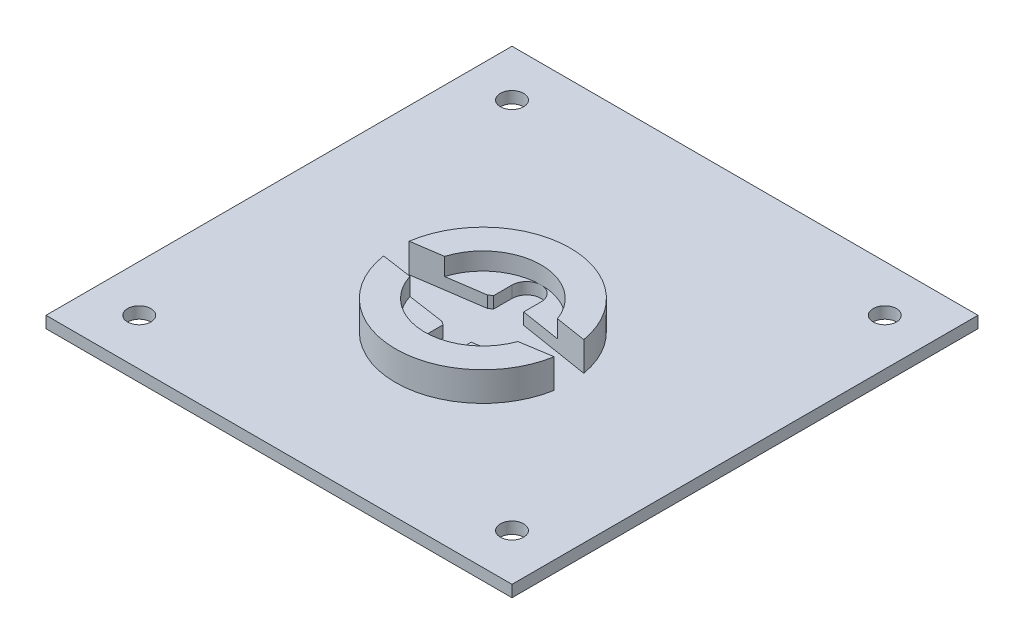
ISO-10303-21;
HEADER;
FILE_DESCRIPTION(('STEP AP214'),'2;1');
FILE_NAME('part.step','',(''),(''),'','','');
FILE_SCHEMA(('AUTOMOTIVE_DESIGN { 1 0 10303 214 1 1 1 1 }'));
ENDSEC;
DATA;
#1=APPLICATION_CONTEXT('core data for automotive mechanical design processes');
#2=APPLICATION_PROTOCOL_DEFINITION('international standard','automotive_design',2000,#1);
#3=PRODUCT_CONTEXT('',#1,'mechanical');
#4=PRODUCT('Part','Part','',(#3));
#5=PRODUCT_RELATED_PRODUCT_CATEGORY('part','',(#4));
#6=PRODUCT_DEFINITION_FORMATION('','',#4);
#7=PRODUCT_DEFINITION_CONTEXT('part definition',#1,'design');
#8=PRODUCT_DEFINITION('design','',#6,#7);
#9=PRODUCT_DEFINITION_SHAPE('','',#8);
#10=(LENGTH_UNIT() NAMED_UNIT(*) SI_UNIT(.MILLI.,.METRE.));
#11=(NAMED_UNIT(*) PLANE_ANGLE_UNIT() SI_UNIT($,.RADIAN.));
#12=(NAMED_UNIT(*) SI_UNIT($,.STERADIAN.) SOLID_ANGLE_UNIT());
#13=UNCERTAINTY_MEASURE_WITH_UNIT(LENGTH_MEASURE(1.E-05),#10,'distance_accuracy_value','');
#14=(GEOMETRIC_REPRESENTATION_CONTEXT(3) GLOBAL_UNCERTAINTY_ASSIGNED_CONTEXT((#13)) GLOBAL_UNIT_ASSIGNED_CONTEXT((#10,
#11,#12)) REPRESENTATION_CONTEXT('',''));
#15=CARTESIAN_POINT('',(0.,0.,0.));
#16=DIRECTION('',(0.,0.,1.));
#17=DIRECTION('',(1.,0.,0.));
#18=AXIS2_PLACEMENT_3D('',#15,#16,#17);
#19=CARTESIAN_POINT('',(0.,7.,5.));
#20=DIRECTION('',(0.,1.,0.));
#21=DIRECTION('',(0.,0.,1.));
#22=AXIS2_PLACEMENT_3D('',#19,#20,#21);
#23=PLANE('',#22);
#24=CARTESIAN_POINT('',(0.,7.,5.));
#25=DIRECTION('',(0.,1.,0.));
#26=DIRECTION('',(0.,0.,1.));
#27=AXIS2_PLACEMENT_3D('',#24,#25,#26);
#28=CIRCLE('',#27,10.);
#29=CARTESIAN_POINT('',(-9.5497865032323,7.,7.96674531139466));
#30=VERTEX_POINT('',#29);
#31=CARTESIAN_POINT('',(9.40513900756368,7.,8.39755209649594));
#32=VERTEX_POINT('',#31);
#33=EDGE_CURVE('E309',#30,#32,#28,.T.);
#34=ORIENTED_EDGE('',*,*,#33,.F.);
#35=DIRECTION('',(-0.989429297222425,0.,-0.145016088065904));
#36=VECTOR('',#35,1.);
#37=CARTESIAN_POINT('',(-0.626506828898814,7.,9.27458925206073));
#38=LINE('',#37,#36);
#39=CARTESIAN_POINT('',(-14.8390439676939,7.,7.19152324305401));
#40=VERTEX_POINT('',#39);
#41=EDGE_CURVE('E259',#30,#40,#38,.T.);
#42=ORIENTED_EDGE('',*,*,#41,.T.);
#43=CARTESIAN_POINT('',(0.,7.,5.));
#44=DIRECTION('',(0.,1.,0.));
#45=DIRECTION('',(0.,0.,1.));
#46=AXIS2_PLACEMENT_3D('',#43,#44,#45);
#47=CIRCLE('',#46,15.);
#48=CARTESIAN_POINT('',(14.7835799441672,7.,7.53885092796277));
#49=VERTEX_POINT('',#48);
#50=EDGE_CURVE('E320',#40,#49,#47,.T.);
#51=ORIENTED_EDGE('',*,*,#50,.T.);
#52=DIRECTION('',(-0.987493548405866,0.,0.157659417279122));
#53=VECTOR('',#52,1.);
#54=CARTESIAN_POINT('',(0.762735687980508,7.,9.77736493016584));
#55=LINE('',#54,#53);
#56=EDGE_CURVE('E276',#49,#32,#55,.T.);
#57=ORIENTED_EDGE('',*,*,#56,.T.);
#58=EDGE_LOOP('',(#34,#42,#51,#57));
#59=FACE_BOUND('',#58,.T.);
#60=ADVANCED_FACE('F35',(#59),#23,.T.);
#61=CARTESIAN_POINT('',(9.40513900756368,7.,1.60244790350406));
#62=VERTEX_POINT('',#61);
#63=CARTESIAN_POINT('',(-9.5497865032323,7.,2.03325468860534));
#64=VERTEX_POINT('',#63);
#65=EDGE_CURVE('E306',#62,#64,#28,.T.);
#66=ORIENTED_EDGE('',*,*,#65,.F.);
#67=DIRECTION('',(0.987493548405866,0.,0.157659417279122));
#68=VECTOR('',#67,1.);
#69=CARTESIAN_POINT('',(0.762735687980509,7.,0.222635069834163));
#70=LINE('',#69,#68);
#71=CARTESIAN_POINT('',(14.7835799441672,7.,2.46114907203723));
#72=VERTEX_POINT('',#71);
#73=EDGE_CURVE('E269',#62,#72,#70,.T.);
#74=ORIENTED_EDGE('',*,*,#73,.T.);
#75=CARTESIAN_POINT('',(-14.8390439676939,7.,2.80847675694599));
#76=VERTEX_POINT('',#75);
#77=EDGE_CURVE('E323',#72,#76,#47,.T.);
#78=ORIENTED_EDGE('',*,*,#77,.T.);
#79=DIRECTION('',(0.989429297222425,0.,-0.145016088065904));
#80=VECTOR('',#79,1.);
#81=CARTESIAN_POINT('',(-0.626506828898814,7.,0.725410747939271));
#82=LINE('',#81,#80);
#83=EDGE_CURVE('E247',#76,#64,#82,.T.);
#84=ORIENTED_EDGE('',*,*,#83,.T.);
#85=EDGE_LOOP('',(#66,#74,#78,#84));
#86=FACE_BOUND('',#85,.T.);
#87=ADVANCED_FACE('F423',(#86),#23,.T.);
#88=CARTESIAN_POINT('',(0.,7.,5.));
#89=DIRECTION('',(0.,-1.,0.));
#90=DIRECTION('',(0.,0.,-1.));
#91=AXIS2_PLACEMENT_3D('',#88,#89,#90);
#92=CYLINDRICAL_SURFACE('',#91,15.);
#93=DIRECTION('',(0.,-1.,0.));
#94=VECTOR('',#93,1.);
#95=CARTESIAN_POINT('',(-14.8390439676939,7.,7.19152324305401));
#96=LINE('',#95,#94);
#97=CARTESIAN_POINT('',(-14.8390439676939,2.,7.19152324305401));
#98=VERTEX_POINT('',#97);
#99=EDGE_CURVE('E262',#98,#40,#96,.F.);
#100=ORIENTED_EDGE('',*,*,#99,.F.);
#101=CARTESIAN_POINT('',(0.,2.,5.));
#102=DIRECTION('',(0.,1.,0.));
#103=DIRECTION('',(0.,0.,1.));
#104=AXIS2_PLACEMENT_3D('',#101,#102,#103);
#105=CIRCLE('',#104,15.);
#106=CARTESIAN_POINT('',(14.7835799441672,2.,7.53885092796277));
#107=VERTEX_POINT('',#106);
#108=EDGE_CURVE('E324',#98,#107,#105,.T.);
#109=ORIENTED_EDGE('',*,*,#108,.T.);
#110=DIRECTION('',(0.,-1.,0.));
#111=VECTOR('',#110,1.);
#112=CARTESIAN_POINT('',(14.7835799441672,7.,7.53885092796277));
#113=LINE('',#112,#111);
#114=EDGE_CURVE('E279',#49,#107,#113,.T.);
#115=ORIENTED_EDGE('',*,*,#114,.F.);
#116=ORIENTED_EDGE('',*,*,#50,.F.);
#117=EDGE_LOOP('',(#100,#109,#115,#116));
#118=FACE_BOUND('',#117,.T.);
#119=ADVANCED_FACE('F440',(#118),#92,.T.);
#120=DIRECTION('',(0.,-1.,0.));
#121=VECTOR('',#120,1.);
#122=CARTESIAN_POINT('',(14.7835799441672,7.,2.46114907203723));
#123=LINE('',#122,#121);
#124=CARTESIAN_POINT('',(14.7835799441672,2.,2.46114907203723));
#125=VERTEX_POINT('',#124);
#126=EDGE_CURVE('E272',#125,#72,#123,.F.);
#127=ORIENTED_EDGE('',*,*,#126,.F.);
#128=CARTESIAN_POINT('',(-14.8390439676939,2.,2.80847675694599));
#129=VERTEX_POINT('',#128);
#130=EDGE_CURVE('E327',#125,#129,#105,.T.);
#131=ORIENTED_EDGE('',*,*,#130,.T.);
#132=DIRECTION('',(0.,-1.,0.));
#133=VECTOR('',#132,1.);
#134=CARTESIAN_POINT('',(-14.8390439676939,7.,2.80847675694599));
#135=LINE('',#134,#133);
#136=EDGE_CURVE('E250',#76,#129,#135,.T.);
#137=ORIENTED_EDGE('',*,*,#136,.F.);
#138=ORIENTED_EDGE('',*,*,#77,.F.);
#139=EDGE_LOOP('',(#127,#131,#137,#138));
#140=FACE_BOUND('',#139,.T.);
#141=ADVANCED_FACE('F416',(#140),#92,.T.);
#142=CARTESIAN_POINT('',(0.,4.,0.));
#143=DIRECTION('',(0.,-1.,0.));
#144=DIRECTION('',(0.,0.,-1.));
#145=AXIS2_PLACEMENT_3D('',#142,#143,#144);
#146=PLANE('',#145);
#147=DIRECTION('',(0.989429297222425,0.,0.145016088065904));
#148=VECTOR('',#147,1.);
#149=CARTESIAN_POINT('',(-1.34392265940378,4.,9.16944092307104));
#150=LINE('',#149,#148);
#151=CARTESIAN_POINT('',(-9.5497865032323,4.,7.96674531139466));
#152=VERTEX_POINT('',#151);
#153=CARTESIAN_POINT('',(-3.11691745392,4.,8.90958125448863));
#154=VERTEX_POINT('',#153);
#155=EDGE_CURVE('E255',#152,#154,#150,.T.);
#156=ORIENTED_EDGE('',*,*,#155,.F.);
#157=CARTESIAN_POINT('',(0.,4.,5.));
#158=DIRECTION('',(0.,-1.,0.));
#159=DIRECTION('',(0.,0.,-1.));
#160=AXIS2_PLACEMENT_3D('',#157,#158,#159);
#161=CIRCLE('',#160,10.);
#162=CARTESIAN_POINT('',(0.,3.99999999999999,15.));
#163=VERTEX_POINT('',#162);
#164=EDGE_CURVE('E317',#152,#163,#161,.F.);
#165=ORIENTED_EDGE('',*,*,#164,.T.);
#166=CARTESIAN_POINT('',(0.,4.,12.5));
#167=DIRECTION('',(0.,-1.,0.));
#168=DIRECTION('',(0.,0.,-1.));
#169=AXIS2_PLACEMENT_3D('',#166,#167,#168);
#170=CIRCLE('',#169,2.5);
#171=CARTESIAN_POINT('',(-2.5,4.,12.5));
#172=VERTEX_POINT('',#171);
#173=EDGE_CURVE('E283',#172,#163,#170,.F.);
#174=ORIENTED_EDGE('',*,*,#173,.F.);
#175=DIRECTION('',(0.,0.,1.));
#176=VECTOR('',#175,1.);
#177=CARTESIAN_POINT('',(-2.5,4.,0.));
#178=LINE('',#177,#176);
#179=CARTESIAN_POINT('',(-2.5,4.,9.33012701892219));
#180=VERTEX_POINT('',#179);
#181=EDGE_CURVE('E197',#180,#172,#178,.T.);
#182=ORIENTED_EDGE('',*,*,#181,.F.);
#183=CARTESIAN_POINT('',(0.,4.,5.));
#184=DIRECTION('',(0.,-1.,0.));
#185=DIRECTION('',(0.,0.,-1.));
#186=AXIS2_PLACEMENT_3D('',#183,#184,#185);
#187=CIRCLE('',#186,5.);
#188=EDGE_CURVE('E358',#180,#154,#187,.T.);
#189=ORIENTED_EDGE('',*,*,#188,.T.);
#190=EDGE_LOOP('',(#156,#165,#174,#182,#189));
#191=FACE_BOUND('',#190,.T.);
#192=ADVANCED_FACE('F496',(#191),#146,.F.);
#193=CARTESIAN_POINT('',(2.5,4.,12.5));
#194=VERTEX_POINT('',#193);
#195=EDGE_CURVE('E281',#163,#194,#170,.F.);
#196=ORIENTED_EDGE('',*,*,#195,.F.);
#197=CARTESIAN_POINT('',(9.40513900756368,4.,8.39755209649594));
#198=VERTEX_POINT('',#197);
#199=EDGE_CURVE('E394',#163,#198,#161,.F.);
#200=ORIENTED_EDGE('',*,*,#199,.T.);
#201=DIRECTION('',(0.987493548405866,0.,-0.157659417279122));
#202=VECTOR('',#201,1.);
#203=CARTESIAN_POINT('',(1.54117397502331,4.,9.65308247088187));
#204=LINE('',#203,#202);
#205=CARTESIAN_POINT('',(2.5,4.,9.5));
#206=VERTEX_POINT('',#205);
#207=EDGE_CURVE('E274',#206,#198,#204,.T.);
#208=ORIENTED_EDGE('',*,*,#207,.F.);
#209=DIRECTION('',(0.,0.,-1.));
#210=VECTOR('',#209,1.);
#211=CARTESIAN_POINT('',(2.5,4.,0.));
#212=LINE('',#211,#210);
#213=EDGE_CURVE('E12',#194,#206,#212,.T.);
#214=ORIENTED_EDGE('',*,*,#213,.F.);
#215=EDGE_LOOP('',(#196,#200,#208,#214));
#216=FACE_BOUND('',#215,.T.);
#217=ADVANCED_FACE('F504',(#216),#146,.F.);
#218=DIRECTION('',(-0.987493548405866,0.,-0.157659417279122));
#219=VECTOR('',#218,1.);
#220=CARTESIAN_POINT('',(-0.0157025990622998,4.,0.0983526105502003));
#221=LINE('',#220,#219);
#222=CARTESIAN_POINT('',(9.40513900756368,4.,1.60244790350406));
#223=VERTEX_POINT('',#222);
#224=CARTESIAN_POINT('',(2.5,4.,0.5));
#225=VERTEX_POINT('',#224);
#226=EDGE_CURVE('E267',#223,#225,#221,.T.);
#227=ORIENTED_EDGE('',*,*,#226,.F.);
#228=CARTESIAN_POINT('',(0.,3.99999999999999,-5.));
#229=VERTEX_POINT('',#228);
#230=EDGE_CURVE('E312',#223,#229,#161,.F.);
#231=ORIENTED_EDGE('',*,*,#230,.T.);
#232=CARTESIAN_POINT('',(0.,4.,-2.5));
#233=DIRECTION('',(0.,-1.,0.));
#234=DIRECTION('',(0.,0.,-1.));
#235=AXIS2_PLACEMENT_3D('',#232,#233,#234);
#236=CIRCLE('',#235,2.5);
#237=CARTESIAN_POINT('',(2.5,4.,-2.5));
#238=VERTEX_POINT('',#237);
#239=EDGE_CURVE('E264',#238,#229,#236,.F.);
#240=ORIENTED_EDGE('',*,*,#239,.F.);
#241=DIRECTION('',(0.,0.,-1.));
#242=VECTOR('',#241,1.);
#243=CARTESIAN_POINT('',(2.5,4.,0.));
#244=LINE('',#243,#242);
#245=EDGE_CURVE('E43',#225,#238,#244,.T.);
#246=ORIENTED_EDGE('',*,*,#245,.F.);
#247=EDGE_LOOP('',(#227,#231,#240,#246));
#248=FACE_BOUND('',#247,.T.);
#249=ADVANCED_FACE('F389',(#248),#146,.F.);
#250=CARTESIAN_POINT('',(-2.5,4.,-2.5));
#251=VERTEX_POINT('',#250);
#252=EDGE_CURVE('E266',#229,#251,#236,.F.);
#253=ORIENTED_EDGE('',*,*,#252,.F.);
#254=CARTESIAN_POINT('',(-9.5497865032323,4.,2.03325468860533));
#255=VERTEX_POINT('',#254);
#256=EDGE_CURVE('E313',#229,#255,#161,.F.);
#257=ORIENTED_EDGE('',*,*,#256,.T.);
#258=DIRECTION('',(-0.989429297222425,0.,0.145016088065904));
#259=VECTOR('',#258,1.);
#260=CARTESIAN_POINT('',(0.0909090016061476,4.,0.620262418949581));
#261=LINE('',#260,#259);
#262=CARTESIAN_POINT('',(-3.11691745392001,4.,1.09041874551138));
#263=VERTEX_POINT('',#262);
#264=EDGE_CURVE('E201',#263,#255,#261,.T.);
#265=ORIENTED_EDGE('',*,*,#264,.F.);
#266=CARTESIAN_POINT('',(-2.5,4.,0.669872981077807));
#267=VERTEX_POINT('',#266);
#268=EDGE_CURVE('E316',#263,#267,#187,.T.);
#269=ORIENTED_EDGE('',*,*,#268,.T.);
#270=DIRECTION('',(0.,0.,1.));
#271=VECTOR('',#270,1.);
#272=CARTESIAN_POINT('',(-2.5,4.,0.));
#273=LINE('',#272,#271);
#274=EDGE_CURVE('E252',#251,#267,#273,.T.);
#275=ORIENTED_EDGE('',*,*,#274,.F.);
#276=EDGE_LOOP('',(#253,#257,#265,#269,#275));
#277=FACE_BOUND('',#276,.T.);
#278=ADVANCED_FACE('F399',(#277),#146,.F.);
#279=CARTESIAN_POINT('',(0.,-26.2842712474619,5.));
#280=DIRECTION('',(0.,1.,0.));
#281=DIRECTION('',(0.,0.,1.));
#282=AXIS2_PLACEMENT_3D('',#279,#280,#281);
#283=CYLINDRICAL_SURFACE('',#282,10.);
#284=ORIENTED_EDGE('',*,*,#199,.F.);
#285=ORIENTED_EDGE('',*,*,#164,.F.);
#286=DIRECTION('',(0.,1.,0.));
#287=VECTOR('',#286,1.);
#288=CARTESIAN_POINT('',(-9.5497865032323,-26.2842712474619,7.96674531139466));
#289=LINE('',#288,#287);
#290=EDGE_CURVE('E257',#30,#152,#289,.F.);
#291=ORIENTED_EDGE('',*,*,#290,.F.);
#292=ORIENTED_EDGE('',*,*,#33,.T.);
#293=DIRECTION('',(0.,1.,0.));
#294=VECTOR('',#293,1.);
#295=CARTESIAN_POINT('',(9.40513900756368,-26.2842712474619,8.39755209649594));
#296=LINE('',#295,#294);
#297=EDGE_CURVE('E374',#198,#32,#296,.T.);
#298=ORIENTED_EDGE('',*,*,#297,.F.);
#299=EDGE_LOOP('',(#284,#285,#291,#292,#298));
#300=FACE_BOUND('',#299,.T.);
#301=ADVANCED_FACE('F491',(#300),#283,.F.);
#302=ORIENTED_EDGE('',*,*,#256,.F.);
#303=ORIENTED_EDGE('',*,*,#230,.F.);
#304=DIRECTION('',(0.,1.,0.));
#305=VECTOR('',#304,1.);
#306=CARTESIAN_POINT('',(9.40513900756368,-26.2842712474619,1.60244790350406));
#307=LINE('',#306,#305);
#308=EDGE_CURVE('E372',#62,#223,#307,.F.);
#309=ORIENTED_EDGE('',*,*,#308,.F.);
#310=ORIENTED_EDGE('',*,*,#65,.T.);
#311=DIRECTION('',(0.,1.,0.));
#312=VECTOR('',#311,1.);
#313=CARTESIAN_POINT('',(-9.5497865032323,-26.2842712474619,2.03325468860534));
#314=LINE('',#313,#312);
#315=EDGE_CURVE('E244',#255,#64,#314,.T.);
#316=ORIENTED_EDGE('',*,*,#315,.F.);
#317=EDGE_LOOP('',(#302,#303,#309,#310,#316));
#318=FACE_BOUND('',#317,.T.);
#319=ADVANCED_FACE('F396',(#318),#283,.F.);
#320=CARTESIAN_POINT('',(0.,7.,5.));
#321=DIRECTION('',(0.,-1.,0.));
#322=DIRECTION('',(0.,0.,-1.));
#323=AXIS2_PLACEMENT_3D('',#320,#321,#322);
#324=CYLINDRICAL_SURFACE('',#323,5.);
#325=CARTESIAN_POINT('',(0.,2.,5.));
#326=DIRECTION('',(0.,1.,0.));
#327=DIRECTION('',(0.,0.,1.));
#328=AXIS2_PLACEMENT_3D('',#325,#326,#327);
#329=CIRCLE('',#328,5.);
#330=CARTESIAN_POINT('',(-3.11691745392,2.,8.90958125448862));
#331=VERTEX_POINT('',#330);
#332=CARTESIAN_POINT('',(-2.5,2.,9.33012701892219));
#333=VERTEX_POINT('',#332);
#334=EDGE_CURVE('E210',#331,#333,#329,.T.);
#335=ORIENTED_EDGE('',*,*,#334,.F.);
#336=DIRECTION('',(0.,-1.,0.));
#337=VECTOR('',#336,1.);
#338=CARTESIAN_POINT('',(-3.11691745392,7.,8.90958125448863));
#339=LINE('',#338,#337);
#340=EDGE_CURVE('E369',#331,#154,#339,.F.);
#341=ORIENTED_EDGE('',*,*,#340,.T.);
#342=ORIENTED_EDGE('',*,*,#188,.F.);
#343=DIRECTION('',(0.,-1.,0.));
#344=VECTOR('',#343,1.);
#345=CARTESIAN_POINT('',(-2.5,7.,9.33012701892219));
#346=LINE('',#345,#344);
#347=EDGE_CURVE('E367',#180,#333,#346,.T.);
#348=ORIENTED_EDGE('',*,*,#347,.T.);
#349=EDGE_LOOP('',(#335,#341,#342,#348));
#350=FACE_BOUND('',#349,.T.);
#351=ADVANCED_FACE('F443',(#350),#324,.F.);
#352=CARTESIAN_POINT('',(-2.5,2.,0.669872981077807));
#353=VERTEX_POINT('',#352);
#354=CARTESIAN_POINT('',(-3.11691745392001,2.,1.09041874551138));
#355=VERTEX_POINT('',#354);
#356=EDGE_CURVE('E318',#353,#355,#329,.T.);
#357=ORIENTED_EDGE('',*,*,#356,.F.);
#358=DIRECTION('',(0.,-1.,0.));
#359=VECTOR('',#358,1.);
#360=CARTESIAN_POINT('',(-2.5,7.,0.669872981077807));
#361=LINE('',#360,#359);
#362=EDGE_CURVE('E364',#353,#267,#361,.F.);
#363=ORIENTED_EDGE('',*,*,#362,.T.);
#364=ORIENTED_EDGE('',*,*,#268,.F.);
#365=DIRECTION('',(0.,-1.,0.));
#366=VECTOR('',#365,1.);
#367=CARTESIAN_POINT('',(-3.11691745392001,7.,1.09041874551138));
#368=LINE('',#367,#366);
#369=EDGE_CURVE('E361',#263,#355,#368,.T.);
#370=ORIENTED_EDGE('',*,*,#369,.T.);
#371=EDGE_LOOP('',(#357,#363,#364,#370));
#372=FACE_BOUND('',#371,.T.);
#373=ADVANCED_FACE('F408',(#372),#324,.F.);
#374=CARTESIAN_POINT('',(40.,2.,40.));
#375=DIRECTION('',(-1.,0.,0.));
#376=DIRECTION('',(0.,0.,1.));
#377=AXIS2_PLACEMENT_3D('',#374,#375,#376);
#378=PLANE('',#377);
#379=DIRECTION('',(0.,0.,-1.));
#380=VECTOR('',#379,1.);
#381=CARTESIAN_POINT('',(40.,0.,40.));
#382=LINE('',#381,#380);
#383=CARTESIAN_POINT('',(40.,0.,40.));
#384=VERTEX_POINT('',#383);
#385=CARTESIAN_POINT('',(40.,0.,-40.));
#386=VERTEX_POINT('',#385);
#387=EDGE_CURVE('E340',#384,#386,#382,.T.);
#388=ORIENTED_EDGE('',*,*,#387,.T.);
#389=DIRECTION('',(0.,-1.,0.));
#390=VECTOR('',#389,1.);
#391=CARTESIAN_POINT('',(40.,2.,-40.));
#392=LINE('',#391,#390);
#393=CARTESIAN_POINT('',(40.,2.,-40.));
#394=VERTEX_POINT('',#393);
#395=EDGE_CURVE('E328',#394,#386,#392,.T.);
#396=ORIENTED_EDGE('',*,*,#395,.F.);
#397=DIRECTION('',(0.,0.,-1.));
#398=VECTOR('',#397,1.);
#399=CARTESIAN_POINT('',(40.,2.,40.));
#400=LINE('',#399,#398);
#401=CARTESIAN_POINT('',(40.,2.,40.));
#402=VERTEX_POINT('',#401);
#403=EDGE_CURVE('E329',#402,#394,#400,.T.);
#404=ORIENTED_EDGE('',*,*,#403,.F.);
#405=DIRECTION('',(0.,-1.,0.));
#406=VECTOR('',#405,1.);
#407=CARTESIAN_POINT('',(40.,2.,40.));
#408=LINE('',#407,#406);
#409=EDGE_CURVE('E339',#402,#384,#408,.T.);
#410=ORIENTED_EDGE('',*,*,#409,.T.);
#411=EDGE_LOOP('',(#388,#396,#404,#410));
#412=FACE_BOUND('',#411,.T.);
#413=ADVANCED_FACE('F37',(#412),#378,.F.);
#414=CARTESIAN_POINT('',(-40.,2.,-40.));
#415=DIRECTION('',(0.,0.,1.));
#416=DIRECTION('',(1.,0.,0.));
#417=AXIS2_PLACEMENT_3D('',#414,#415,#416);
#418=PLANE('',#417);
#419=DIRECTION('',(-1.,0.,0.));
#420=VECTOR('',#419,1.);
#421=CARTESIAN_POINT('',(-40.,0.,-40.));
#422=LINE('',#421,#420);
#423=CARTESIAN_POINT('',(-40.,0.,-40.));
#424=VERTEX_POINT('',#423);
#425=EDGE_CURVE('E343',#386,#424,#422,.T.);
#426=ORIENTED_EDGE('',*,*,#425,.T.);
#427=DIRECTION('',(0.,-1.,0.));
#428=VECTOR('',#427,1.);
#429=CARTESIAN_POINT('',(-40.,2.,-40.));
#430=LINE('',#429,#428);
#431=CARTESIAN_POINT('',(-40.,2.,-40.));
#432=VERTEX_POINT('',#431);
#433=EDGE_CURVE('E353',#432,#424,#430,.T.);
#434=ORIENTED_EDGE('',*,*,#433,.F.);
#435=DIRECTION('',(-1.,0.,0.));
#436=VECTOR('',#435,1.);
#437=CARTESIAN_POINT('',(-40.,2.,-40.));
#438=LINE('',#437,#436);
#439=EDGE_CURVE('E332',#394,#432,#438,.T.);
#440=ORIENTED_EDGE('',*,*,#439,.F.);
#441=ORIENTED_EDGE('',*,*,#395,.T.);
#442=EDGE_LOOP('',(#426,#434,#440,#441));
#443=FACE_BOUND('',#442,.T.);
#444=ADVANCED_FACE('F461',(#443),#418,.F.);
#445=CARTESIAN_POINT('',(-40.,2.,40.));
#446=DIRECTION('',(1.,0.,0.));
#447=DIRECTION('',(0.,0.,-1.));
#448=AXIS2_PLACEMENT_3D('',#445,#446,#447);
#449=PLANE('',#448);
#450=DIRECTION('',(0.,0.,1.));
#451=VECTOR('',#450,1.);
#452=CARTESIAN_POINT('',(-40.,0.,40.));
#453=LINE('',#452,#451);
#454=CARTESIAN_POINT('',(-40.,0.,40.));
#455=VERTEX_POINT('',#454);
#456=EDGE_CURVE('E345',#424,#455,#453,.T.);
#457=ORIENTED_EDGE('',*,*,#456,.T.);
#458=DIRECTION('',(0.,-1.,0.));
#459=VECTOR('',#458,1.);
#460=CARTESIAN_POINT('',(-40.,2.,40.));
#461=LINE('',#460,#459);
#462=CARTESIAN_POINT('',(-40.,2.,40.));
#463=VERTEX_POINT('',#462);
#464=EDGE_CURVE('E350',#463,#455,#461,.T.);
#465=ORIENTED_EDGE('',*,*,#464,.F.);
#466=DIRECTION('',(0.,0.,1.));
#467=VECTOR('',#466,1.);
#468=CARTESIAN_POINT('',(-40.,2.,40.));
#469=LINE('',#468,#467);
#470=EDGE_CURVE('E335',#432,#463,#469,.T.);
#471=ORIENTED_EDGE('',*,*,#470,.F.);
#472=ORIENTED_EDGE('',*,*,#433,.T.);
#473=EDGE_LOOP('',(#457,#465,#471,#472));
#474=FACE_BOUND('',#473,.T.);
#475=ADVANCED_FACE('F458',(#474),#449,.F.);
#476=CARTESIAN_POINT('',(-40.,2.,40.));
#477=DIRECTION('',(0.,0.,-1.));
#478=DIRECTION('',(-1.,0.,0.));
#479=AXIS2_PLACEMENT_3D('',#476,#477,#478);
#480=PLANE('',#479);
#481=DIRECTION('',(1.,0.,0.));
#482=VECTOR('',#481,1.);
#483=CARTESIAN_POINT('',(-40.,0.,40.));
#484=LINE('',#483,#482);
#485=EDGE_CURVE('E333',#455,#384,#484,.T.);
#486=ORIENTED_EDGE('',*,*,#485,.T.);
#487=ORIENTED_EDGE('',*,*,#409,.F.);
#488=DIRECTION('',(1.,0.,0.));
#489=VECTOR('',#488,1.);
#490=CARTESIAN_POINT('',(-40.,2.,40.));
#491=LINE('',#490,#489);
#492=EDGE_CURVE('E337',#463,#402,#491,.T.);
#493=ORIENTED_EDGE('',*,*,#492,.F.);
#494=ORIENTED_EDGE('',*,*,#464,.T.);
#495=EDGE_LOOP('',(#486,#487,#493,#494));
#496=FACE_BOUND('',#495,.T.);
#497=ADVANCED_FACE('F451',(#496),#480,.F.);
#498=CARTESIAN_POINT('',(0.,2.,0.));
#499=DIRECTION('',(0.,-1.,0.));
#500=DIRECTION('',(0.,0.,-1.));
#501=AXIS2_PLACEMENT_3D('',#498,#499,#500);
#502=PLANE('',#501);
#503=ORIENTED_EDGE('',*,*,#108,.F.);
#504=DIRECTION('',(0.989429297222425,0.,0.145016088065904));
#505=VECTOR('',#504,1.);
#506=CARTESIAN_POINT('',(-2.5,2.,9.));
#507=LINE('',#506,#505);
#508=EDGE_CURVE('E50',#98,#331,#507,.T.);
#509=ORIENTED_EDGE('',*,*,#508,.T.);
#510=ORIENTED_EDGE('',*,*,#334,.T.);
#511=DIRECTION('',(0.,0.,1.));
#512=VECTOR('',#511,1.);
#513=CARTESIAN_POINT('',(-2.5,2.,9.));
#514=LINE('',#513,#512);
#515=CARTESIAN_POINT('',(-2.5,2.,12.5));
#516=VERTEX_POINT('',#515);
#517=EDGE_CURVE('E194',#333,#516,#514,.T.);
#518=ORIENTED_EDGE('',*,*,#517,.T.);
#519=CARTESIAN_POINT('',(0.,2.,12.5));
#520=DIRECTION('',(0.,1.,0.));
#521=DIRECTION('',(0.,0.,1.));
#522=AXIS2_PLACEMENT_3D('',#519,#520,#521);
#523=CIRCLE('',#522,2.5);
#524=CARTESIAN_POINT('',(2.5,2.,12.5));
#525=VERTEX_POINT('',#524);
#526=EDGE_CURVE('E207',#516,#525,#523,.T.);
#527=ORIENTED_EDGE('',*,*,#526,.T.);
#528=DIRECTION('',(0.,0.,-1.));
#529=VECTOR('',#528,1.);
#530=CARTESIAN_POINT('',(2.5,2.,12.5));
#531=LINE('',#530,#529);
#532=CARTESIAN_POINT('',(2.5,2.,9.5));
#533=VERTEX_POINT('',#532);
#534=EDGE_CURVE('E214',#525,#533,#531,.T.);
#535=ORIENTED_EDGE('',*,*,#534,.T.);
#536=DIRECTION('',(0.987493548405865,0.,-0.157659417279122));
#537=VECTOR('',#536,1.);
#538=CARTESIAN_POINT('',(2.5,2.,9.5));
#539=LINE('',#538,#537);
#540=EDGE_CURVE('E216',#533,#107,#539,.T.);
#541=ORIENTED_EDGE('',*,*,#540,.T.);
#542=EDGE_LOOP('',(#503,#509,#510,#518,#527,#535,#541));
#543=FACE_BOUND('',#542,.T.);
#544=ORIENTED_EDGE('',*,*,#130,.F.);
#545=DIRECTION('',(-0.987493548405865,0.,-0.157659417279122));
#546=VECTOR('',#545,1.);
#547=CARTESIAN_POINT('',(2.5,2.,0.5));
#548=LINE('',#547,#546);
#549=CARTESIAN_POINT('',(2.5,2.,0.5));
#550=VERTEX_POINT('',#549);
#551=EDGE_CURVE('E222',#125,#550,#548,.T.);
#552=ORIENTED_EDGE('',*,*,#551,.T.);
#553=DIRECTION('',(0.,0.,-1.));
#554=VECTOR('',#553,1.);
#555=CARTESIAN_POINT('',(2.5,2.,-2.5));
#556=LINE('',#555,#554);
#557=CARTESIAN_POINT('',(2.5,2.,-2.5));
#558=VERTEX_POINT('',#557);
#559=EDGE_CURVE('E225',#550,#558,#556,.T.);
#560=ORIENTED_EDGE('',*,*,#559,.T.);
#561=CARTESIAN_POINT('',(0.,2.,-2.5));
#562=DIRECTION('',(0.,1.,0.));
#563=DIRECTION('',(0.,0.,-1.));
#564=AXIS2_PLACEMENT_3D('',#561,#562,#563);
#565=CIRCLE('',#564,2.5);
#566=CARTESIAN_POINT('',(-2.5,2.,-2.5));
#567=VERTEX_POINT('',#566);
#568=EDGE_CURVE('E228',#558,#567,#565,.T.);
#569=ORIENTED_EDGE('',*,*,#568,.T.);
#570=DIRECTION('',(0.,0.,1.));
#571=VECTOR('',#570,1.);
#572=CARTESIAN_POINT('',(-2.5,2.,1.));
#573=LINE('',#572,#571);
#574=EDGE_CURVE('E58',#567,#353,#573,.T.);
#575=ORIENTED_EDGE('',*,*,#574,.T.);
#576=ORIENTED_EDGE('',*,*,#356,.T.);
#577=DIRECTION('',(-0.989429297222425,0.,0.145016088065904));
#578=VECTOR('',#577,1.);
#579=CARTESIAN_POINT('',(-2.5,2.,1.));
#580=LINE('',#579,#578);
#581=EDGE_CURVE('E231',#355,#129,#580,.T.);
#582=ORIENTED_EDGE('',*,*,#581,.T.);
#583=EDGE_LOOP('',(#544,#552,#560,#569,#575,#576,#582));
#584=FACE_BOUND('',#583,.T.);
#585=CARTESIAN_POINT('',(-32.,2.,32.));
#586=DIRECTION('',(0.,1.,0.));
#587=DIRECTION('',(0.,0.,1.));
#588=AXIS2_PLACEMENT_3D('',#585,#586,#587);
#589=CIRCLE('',#588,2.);
#590=CARTESIAN_POINT('',(-32.,2.,34.));
#591=VERTEX_POINT('',#590);
#592=EDGE_CURVE('E300',#591,#591,#589,.T.);
#593=ORIENTED_EDGE('',*,*,#592,.F.);
#594=EDGE_LOOP('',(#593));
#595=FACE_BOUND('',#594,.T.);
#596=CARTESIAN_POINT('',(32.,2.,32.));
#597=DIRECTION('',(0.,1.,0.));
#598=DIRECTION('',(0.,0.,1.));
#599=AXIS2_PLACEMENT_3D('',#596,#597,#598);
#600=CIRCLE('',#599,2.);
#601=CARTESIAN_POINT('',(32.,2.,34.));
#602=VERTEX_POINT('',#601);
#603=EDGE_CURVE('E294',#602,#602,#600,.T.);
#604=ORIENTED_EDGE('',*,*,#603,.F.);
#605=EDGE_LOOP('',(#604));
#606=FACE_BOUND('',#605,.T.);
#607=CARTESIAN_POINT('',(32.,2.,-32.));
#608=DIRECTION('',(0.,1.,0.));
#609=DIRECTION('',(0.,0.,1.));
#610=AXIS2_PLACEMENT_3D('',#607,#608,#609);
#611=CIRCLE('',#610,2.);
#612=CARTESIAN_POINT('',(32.,2.,-30.));
#613=VERTEX_POINT('',#612);
#614=EDGE_CURVE('E288',#613,#613,#611,.T.);
#615=ORIENTED_EDGE('',*,*,#614,.F.);
#616=EDGE_LOOP('',(#615));
#617=FACE_BOUND('',#616,.T.);
#618=CARTESIAN_POINT('',(-32.,2.,-32.));
#619=DIRECTION('',(0.,1.,0.));
#620=DIRECTION('',(0.,0.,1.));
#621=AXIS2_PLACEMENT_3D('',#618,#619,#620);
#622=CIRCLE('',#621,2.);
#623=CARTESIAN_POINT('',(-32.,2.,-30.));
#624=VERTEX_POINT('',#623);
#625=EDGE_CURVE('E287',#624,#624,#622,.T.);
#626=ORIENTED_EDGE('',*,*,#625,.F.);
#627=EDGE_LOOP('',(#626));
#628=FACE_BOUND('',#627,.T.);
#629=ORIENTED_EDGE('',*,*,#403,.T.);
#630=ORIENTED_EDGE('',*,*,#439,.T.);
#631=ORIENTED_EDGE('',*,*,#470,.T.);
#632=ORIENTED_EDGE('',*,*,#492,.T.);
#633=EDGE_LOOP('',(#629,#630,#631,#632));
#634=FACE_BOUND('',#633,.T.);
#635=ADVANCED_FACE('F205',(#543,#584,#595,#606,#617,#628,#634),#502,.F.);
#636=CARTESIAN_POINT('',(0.,0.,0.));
#637=DIRECTION('',(0.,-1.,0.));
#638=DIRECTION('',(0.,0.,-1.));
#639=AXIS2_PLACEMENT_3D('',#636,#637,#638);
#640=PLANE('',#639);
#641=CARTESIAN_POINT('',(-32.,0.,32.));
#642=DIRECTION('',(0.,1.,0.));
#643=DIRECTION('',(0.,0.,1.));
#644=AXIS2_PLACEMENT_3D('',#641,#642,#643);
#645=CIRCLE('',#644,2.);
#646=CARTESIAN_POINT('',(-32.,0.,34.));
#647=VERTEX_POINT('',#646);
#648=EDGE_CURVE('E297',#647,#647,#645,.T.);
#649=ORIENTED_EDGE('',*,*,#648,.T.);
#650=EDGE_LOOP('',(#649));
#651=FACE_BOUND('',#650,.T.);
#652=CARTESIAN_POINT('',(32.,0.,32.));
#653=DIRECTION('',(0.,1.,0.));
#654=DIRECTION('',(0.,0.,1.));
#655=AXIS2_PLACEMENT_3D('',#652,#653,#654);
#656=CIRCLE('',#655,2.);
#657=CARTESIAN_POINT('',(32.,0.,34.));
#658=VERTEX_POINT('',#657);
#659=EDGE_CURVE('E291',#658,#658,#656,.T.);
#660=ORIENTED_EDGE('',*,*,#659,.T.);
#661=EDGE_LOOP('',(#660));
#662=FACE_BOUND('',#661,.T.);
#663=CARTESIAN_POINT('',(32.,0.,-32.));
#664=DIRECTION('',(0.,1.,0.));
#665=DIRECTION('',(0.,0.,1.));
#666=AXIS2_PLACEMENT_3D('',#663,#664,#665);
#667=CIRCLE('',#666,2.);
#668=CARTESIAN_POINT('',(32.,0.,-30.));
#669=VERTEX_POINT('',#668);
#670=EDGE_CURVE('E284',#669,#669,#667,.T.);
#671=ORIENTED_EDGE('',*,*,#670,.T.);
#672=EDGE_LOOP('',(#671));
#673=FACE_BOUND('',#672,.T.);
#674=CARTESIAN_POINT('',(-32.,0.,-32.));
#675=DIRECTION('',(0.,1.,0.));
#676=DIRECTION('',(0.,0.,1.));
#677=AXIS2_PLACEMENT_3D('',#674,#675,#676);
#678=CIRCLE('',#677,2.);
#679=CARTESIAN_POINT('',(-32.,0.,-30.));
#680=VERTEX_POINT('',#679);
#681=EDGE_CURVE('E303',#680,#680,#678,.T.);
#682=ORIENTED_EDGE('',*,*,#681,.T.);
#683=EDGE_LOOP('',(#682));
#684=FACE_BOUND('',#683,.T.);
#685=ORIENTED_EDGE('',*,*,#387,.F.);
#686=ORIENTED_EDGE('',*,*,#485,.F.);
#687=ORIENTED_EDGE('',*,*,#456,.F.);
#688=ORIENTED_EDGE('',*,*,#425,.F.);
#689=EDGE_LOOP('',(#685,#686,#687,#688));
#690=FACE_BOUND('',#689,.T.);
#691=ADVANCED_FACE('F450',(#651,#662,#673,#684,#690),#640,.T.);
#692=CARTESIAN_POINT('',(-32.,0.,-32.));
#693=DIRECTION('',(0.,1.,0.));
#694=DIRECTION('',(0.,0.,1.));
#695=AXIS2_PLACEMENT_3D('',#692,#693,#694);
#696=CYLINDRICAL_SURFACE('',#695,2.);
#697=ORIENTED_EDGE('',*,*,#681,.F.);
#698=EDGE_LOOP('',(#697));
#699=FACE_BOUND('',#698,.T.);
#700=ORIENTED_EDGE('',*,*,#625,.T.);
#701=EDGE_LOOP('',(#700));
#702=FACE_BOUND('',#701,.T.);
#703=ADVANCED_FACE('F454',(#699,#702),#696,.F.);
#704=CARTESIAN_POINT('',(32.,0.,-32.));
#705=DIRECTION('',(0.,1.,0.));
#706=DIRECTION('',(0.,0.,1.));
#707=AXIS2_PLACEMENT_3D('',#704,#705,#706);
#708=CYLINDRICAL_SURFACE('',#707,2.);
#709=ORIENTED_EDGE('',*,*,#670,.F.);
#710=EDGE_LOOP('',(#709));
#711=FACE_BOUND('',#710,.T.);
#712=ORIENTED_EDGE('',*,*,#614,.T.);
#713=EDGE_LOOP('',(#712));
#714=FACE_BOUND('',#713,.T.);
#715=ADVANCED_FACE('F532',(#711,#714),#708,.F.);
#716=CARTESIAN_POINT('',(32.,0.,32.));
#717=DIRECTION('',(0.,1.,0.));
#718=DIRECTION('',(0.,0.,1.));
#719=AXIS2_PLACEMENT_3D('',#716,#717,#718);
#720=CYLINDRICAL_SURFACE('',#719,2.);
#721=ORIENTED_EDGE('',*,*,#659,.F.);
#722=EDGE_LOOP('',(#721));
#723=FACE_BOUND('',#722,.T.);
#724=ORIENTED_EDGE('',*,*,#603,.T.);
#725=EDGE_LOOP('',(#724));
#726=FACE_BOUND('',#725,.T.);
#727=ADVANCED_FACE('F535',(#723,#726),#720,.F.);
#728=CARTESIAN_POINT('',(-32.,0.,32.));
#729=DIRECTION('',(0.,1.,0.));
#730=DIRECTION('',(0.,0.,1.));
#731=AXIS2_PLACEMENT_3D('',#728,#729,#730);
#732=CYLINDRICAL_SURFACE('',#731,2.);
#733=ORIENTED_EDGE('',*,*,#648,.F.);
#734=EDGE_LOOP('',(#733));
#735=FACE_BOUND('',#734,.T.);
#736=ORIENTED_EDGE('',*,*,#592,.T.);
#737=EDGE_LOOP('',(#736));
#738=FACE_BOUND('',#737,.T.);
#739=ADVANCED_FACE('F539',(#735,#738),#732,.F.);
#740=CARTESIAN_POINT('',(-2.5,12.,1.));
#741=DIRECTION('',(1.,0.,0.));
#742=DIRECTION('',(0.,0.,-1.));
#743=AXIS2_PLACEMENT_3D('',#740,#741,#742);
#744=PLANE('',#743);
#745=ORIENTED_EDGE('',*,*,#274,.T.);
#746=ORIENTED_EDGE('',*,*,#362,.F.);
#747=ORIENTED_EDGE('',*,*,#574,.F.);
#748=DIRECTION('',(0.,-1.,0.));
#749=VECTOR('',#748,1.);
#750=CARTESIAN_POINT('',(-2.5,12.,-2.5));
#751=LINE('',#750,#749);
#752=EDGE_CURVE('E234',#251,#567,#751,.T.);
#753=ORIENTED_EDGE('',*,*,#752,.F.);
#754=EDGE_LOOP('',(#745,#746,#747,#753));
#755=FACE_BOUND('',#754,.T.);
#756=ADVANCED_FACE('F405',(#755),#744,.T.);
#757=CARTESIAN_POINT('',(-2.5,12.,9.));
#758=DIRECTION('',(1.,0.,0.));
#759=DIRECTION('',(0.,0.,-1.));
#760=AXIS2_PLACEMENT_3D('',#757,#758,#759);
#761=PLANE('',#760);
#762=ORIENTED_EDGE('',*,*,#181,.T.);
#763=DIRECTION('',(0.,-1.,0.));
#764=VECTOR('',#763,1.);
#765=CARTESIAN_POINT('',(-2.5,12.,12.5));
#766=LINE('',#765,#764);
#767=EDGE_CURVE('E191',#172,#516,#766,.T.);
#768=ORIENTED_EDGE('',*,*,#767,.T.);
#769=ORIENTED_EDGE('',*,*,#517,.F.);
#770=ORIENTED_EDGE('',*,*,#347,.F.);
#771=EDGE_LOOP('',(#762,#768,#769,#770));
#772=FACE_BOUND('',#771,.T.);
#773=ADVANCED_FACE('F193',(#772),#761,.T.);
#774=CARTESIAN_POINT('',(2.5,12.,0.5));
#775=DIRECTION('',(-0.157659417279122,0.,0.987493548405866));
#776=DIRECTION('',(0.987493548405866,0.,0.157659417279122));
#777=AXIS2_PLACEMENT_3D('',#774,#775,#776);
#778=PLANE('',#777);
#779=ORIENTED_EDGE('',*,*,#126,.T.);
#780=ORIENTED_EDGE('',*,*,#73,.F.);
#781=ORIENTED_EDGE('',*,*,#308,.T.);
#782=ORIENTED_EDGE('',*,*,#226,.T.);
#783=DIRECTION('',(0.,-1.,0.));
#784=VECTOR('',#783,1.);
#785=CARTESIAN_POINT('',(2.5,12.,0.5));
#786=LINE('',#785,#784);
#787=EDGE_CURVE('E238',#225,#550,#786,.T.);
#788=ORIENTED_EDGE('',*,*,#787,.T.);
#789=ORIENTED_EDGE('',*,*,#551,.F.);
#790=EDGE_LOOP('',(#779,#780,#781,#782,#788,#789));
#791=FACE_BOUND('',#790,.T.);
#792=ADVANCED_FACE('F420',(#791),#778,.T.);
#793=CARTESIAN_POINT('',(2.5,12.,9.5));
#794=DIRECTION('',(-0.157659417279122,0.,-0.987493548405866));
#795=DIRECTION('',(-0.987493548405866,0.,0.157659417279122));
#796=AXIS2_PLACEMENT_3D('',#793,#794,#795);
#797=PLANE('',#796);
#798=ORIENTED_EDGE('',*,*,#114,.T.);
#799=ORIENTED_EDGE('',*,*,#540,.F.);
#800=DIRECTION('',(0.,-1.,0.));
#801=VECTOR('',#800,1.);
#802=CARTESIAN_POINT('',(2.5,12.,9.5));
#803=LINE('',#802,#801);
#804=EDGE_CURVE('E240',#206,#533,#803,.T.);
#805=ORIENTED_EDGE('',*,*,#804,.F.);
#806=ORIENTED_EDGE('',*,*,#207,.T.);
#807=ORIENTED_EDGE('',*,*,#297,.T.);
#808=ORIENTED_EDGE('',*,*,#56,.F.);
#809=EDGE_LOOP('',(#798,#799,#805,#806,#807,#808));
#810=FACE_BOUND('',#809,.T.);
#811=ADVANCED_FACE('F510',(#810),#797,.T.);
#812=CARTESIAN_POINT('',(0.,12.,-2.5));
#813=DIRECTION('',(0.,-1.,0.));
#814=DIRECTION('',(0.,0.,-1.));
#815=AXIS2_PLACEMENT_3D('',#812,#813,#814);
#816=CYLINDRICAL_SURFACE('',#815,2.5);
#817=ORIENTED_EDGE('',*,*,#252,.T.);
#818=ORIENTED_EDGE('',*,*,#752,.T.);
#819=ORIENTED_EDGE('',*,*,#568,.F.);
#820=DIRECTION('',(0.,-1.,0.));
#821=VECTOR('',#820,1.);
#822=CARTESIAN_POINT('',(2.5,12.,-2.5));
#823=LINE('',#822,#821);
#824=EDGE_CURVE('E236',#238,#558,#823,.T.);
#825=ORIENTED_EDGE('',*,*,#824,.F.);
#826=ORIENTED_EDGE('',*,*,#239,.T.);
#827=EDGE_LOOP('',(#817,#818,#819,#825,#826));
#828=FACE_BOUND('',#827,.T.);
#829=ADVANCED_FACE('F386',(#828),#816,.F.);
#830=CARTESIAN_POINT('',(2.5,12.,-2.5));
#831=DIRECTION('',(-1.,0.,0.));
#832=DIRECTION('',(0.,0.,1.));
#833=AXIS2_PLACEMENT_3D('',#830,#831,#832);
#834=PLANE('',#833);
#835=ORIENTED_EDGE('',*,*,#245,.T.);
#836=ORIENTED_EDGE('',*,*,#824,.T.);
#837=ORIENTED_EDGE('',*,*,#559,.F.);
#838=ORIENTED_EDGE('',*,*,#787,.F.);
#839=EDGE_LOOP('',(#835,#836,#837,#838));
#840=FACE_BOUND('',#839,.T.);
#841=ADVANCED_FACE('F379',(#840),#834,.T.);
#842=CARTESIAN_POINT('',(2.5,12.,12.5));
#843=DIRECTION('',(-1.,0.,0.));
#844=DIRECTION('',(0.,0.,1.));
#845=AXIS2_PLACEMENT_3D('',#842,#843,#844);
#846=PLANE('',#845);
#847=ORIENTED_EDGE('',*,*,#213,.T.);
#848=ORIENTED_EDGE('',*,*,#804,.T.);
#849=ORIENTED_EDGE('',*,*,#534,.F.);
#850=DIRECTION('',(0.,-1.,0.));
#851=VECTOR('',#850,1.);
#852=CARTESIAN_POINT('',(2.5,12.,12.5));
#853=LINE('',#852,#851);
#854=EDGE_CURVE('E202',#194,#525,#853,.T.);
#855=ORIENTED_EDGE('',*,*,#854,.F.);
#856=EDGE_LOOP('',(#847,#848,#849,#855));
#857=FACE_BOUND('',#856,.T.);
#858=ADVANCED_FACE('F518',(#857),#846,.T.);
#859=CARTESIAN_POINT('',(0.,12.,12.5));
#860=DIRECTION('',(0.,-1.,0.));
#861=DIRECTION('',(0.,0.,-1.));
#862=AXIS2_PLACEMENT_3D('',#859,#860,#861);
#863=CYLINDRICAL_SURFACE('',#862,2.5);
#864=ORIENTED_EDGE('',*,*,#173,.T.);
#865=ORIENTED_EDGE('',*,*,#195,.T.);
#866=ORIENTED_EDGE('',*,*,#854,.T.);
#867=ORIENTED_EDGE('',*,*,#526,.F.);
#868=ORIENTED_EDGE('',*,*,#767,.F.);
#869=EDGE_LOOP('',(#864,#865,#866,#867,#868));
#870=FACE_BOUND('',#869,.T.);
#871=ADVANCED_FACE('F212',(#870),#863,.F.);
#872=CARTESIAN_POINT('',(-2.5,12.,9.));
#873=DIRECTION('',(0.145016088065904,0.,-0.989429297222425));
#874=DIRECTION('',(-0.989429297222425,0.,-0.145016088065904));
#875=AXIS2_PLACEMENT_3D('',#872,#873,#874);
#876=PLANE('',#875);
#877=ORIENTED_EDGE('',*,*,#99,.T.);
#878=ORIENTED_EDGE('',*,*,#41,.F.);
#879=ORIENTED_EDGE('',*,*,#290,.T.);
#880=ORIENTED_EDGE('',*,*,#155,.T.);
#881=ORIENTED_EDGE('',*,*,#340,.F.);
#882=ORIENTED_EDGE('',*,*,#508,.F.);
#883=EDGE_LOOP('',(#877,#878,#879,#880,#881,#882));
#884=FACE_BOUND('',#883,.T.);
#885=ADVANCED_FACE('F426',(#884),#876,.T.);
#886=CARTESIAN_POINT('',(-2.5,12.,1.));
#887=DIRECTION('',(0.145016088065904,0.,0.989429297222425));
#888=DIRECTION('',(0.989429297222425,0.,-0.145016088065904));
#889=AXIS2_PLACEMENT_3D('',#886,#887,#888);
#890=PLANE('',#889);
#891=ORIENTED_EDGE('',*,*,#136,.T.);
#892=ORIENTED_EDGE('',*,*,#581,.F.);
#893=ORIENTED_EDGE('',*,*,#369,.F.);
#894=ORIENTED_EDGE('',*,*,#264,.T.);
#895=ORIENTED_EDGE('',*,*,#315,.T.);
#896=ORIENTED_EDGE('',*,*,#83,.F.);
#897=EDGE_LOOP('',(#891,#892,#893,#894,#895,#896));
#898=FACE_BOUND('',#897,.T.);
#899=ADVANCED_FACE('F424',(#898),#890,.T.);
#900=CLOSED_SHELL('',(#60,#87,#119,#141,#192,#217,#249,#278,#301,#319,#351,#373,#413,#444,#475,
#497,#635,#691,#703,#715,#727,#739,#756,#773,#792,#811,#829,#841,#858,#871,#885,#899));
#901=MANIFOLD_SOLID_BREP('B2',#900);
#902=ADVANCED_BREP_SHAPE_REPRESENTATION('',(#18,#901),#14);
#903=SHAPE_DEFINITION_REPRESENTATION(#9,#902);
ENDSEC;
END-ISO-10303-21;
